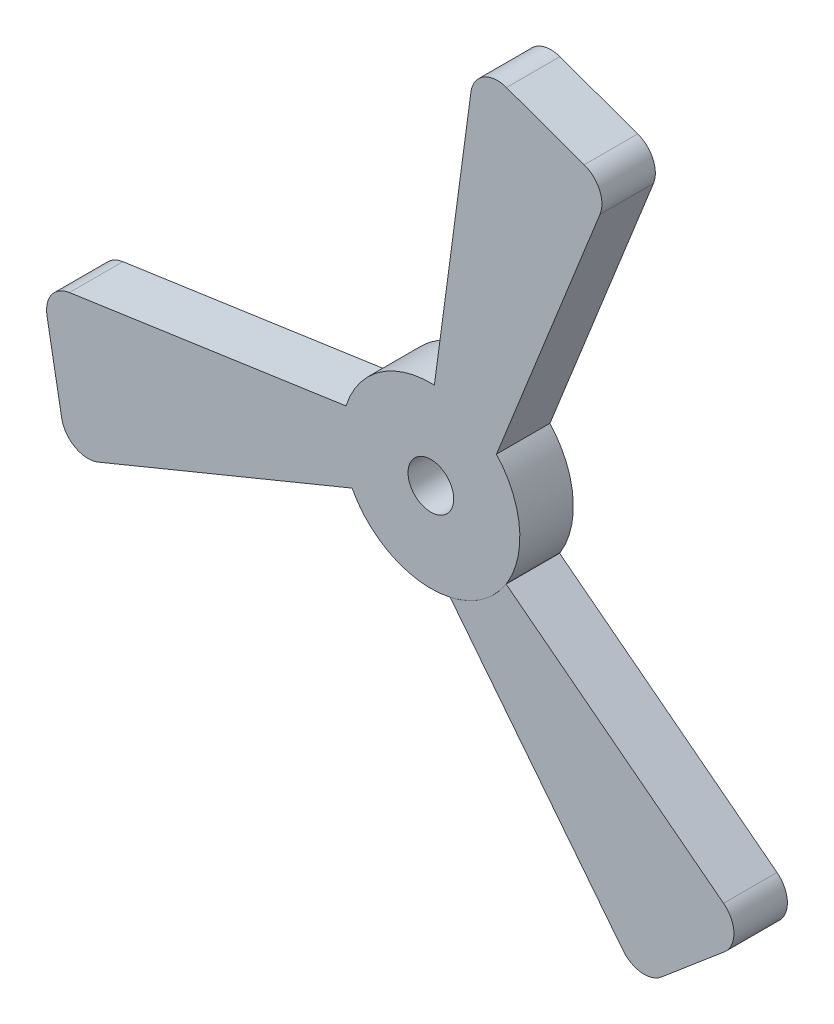
ISO-10303-21;
HEADER;
FILE_DESCRIPTION(('STEP AP214'),'2;1');
FILE_NAME('part.step','',(''),(''),'','','');
FILE_SCHEMA(('AUTOMOTIVE_DESIGN { 1 0 10303 214 1 1 1 1 }'));
ENDSEC;
DATA;
#1=APPLICATION_CONTEXT('core data for automotive mechanical design processes');
#2=APPLICATION_PROTOCOL_DEFINITION('international standard','automotive_design',2000,#1);
#3=PRODUCT_CONTEXT('',#1,'mechanical');
#4=PRODUCT('Part','Part','',(#3));
#5=PRODUCT_RELATED_PRODUCT_CATEGORY('part','',(#4));
#6=PRODUCT_DEFINITION_FORMATION('','',#4);
#7=PRODUCT_DEFINITION_CONTEXT('part definition',#1,'design');
#8=PRODUCT_DEFINITION('design','',#6,#7);
#9=PRODUCT_DEFINITION_SHAPE('','',#8);
#10=(LENGTH_UNIT() NAMED_UNIT(*) SI_UNIT(.MILLI.,.METRE.));
#11=(NAMED_UNIT(*) PLANE_ANGLE_UNIT() SI_UNIT($,.RADIAN.));
#12=(NAMED_UNIT(*) SI_UNIT($,.STERADIAN.) SOLID_ANGLE_UNIT());
#13=UNCERTAINTY_MEASURE_WITH_UNIT(LENGTH_MEASURE(1.E-05),#10,'distance_accuracy_value','');
#14=(GEOMETRIC_REPRESENTATION_CONTEXT(3) GLOBAL_UNCERTAINTY_ASSIGNED_CONTEXT((#13)) GLOBAL_UNIT_ASSIGNED_CONTEXT((#10,
#11,#12)) REPRESENTATION_CONTEXT('',''));
#15=CARTESIAN_POINT('',(0.,0.,0.));
#16=DIRECTION('',(0.,0.,1.));
#17=DIRECTION('',(1.,0.,0.));
#18=AXIS2_PLACEMENT_3D('',#15,#16,#17);
#19=CARTESIAN_POINT('',(14.2466992094165,-8.61707964663272,10.));
#20=CARTESIAN_POINT('',(10.5004524831012,-14.6092039712169,10.));
#21=CARTESIAN_POINT('',(3.6094824578494,-16.2540498456993,10.));
#22=B_SPLINE_CURVE_WITH_KNOTS('',2,(#19,#20,#21),.UNSPECIFIED.,.F.,.F.,(3,3),(0.,1.),.UNSPECIFIED.);
#23=DIRECTION('',(0.,0.,-1.));
#24=VECTOR('',#23,1.);
#25=SURFACE_OF_LINEAR_EXTRUSION('',#22,#24);
#26=CARTESIAN_POINT('',(14.2466992094165,-8.61707964663272,0.));
#27=CARTESIAN_POINT('',(10.5004524831012,-14.6092039712169,0.));
#28=CARTESIAN_POINT('',(3.6094824578494,-16.2540498456993,0.));
#29=B_SPLINE_CURVE_WITH_KNOTS('',2,(#26,#27,#28),.UNSPECIFIED.,.F.,.F.,(3,3),(0.,1.),.UNSPECIFIED.);
#30=CARTESIAN_POINT('',(14.2466992094165,-8.61707964663272,0.));
#31=VERTEX_POINT('',#30);
#32=CARTESIAN_POINT('',(3.6094824578494,-16.2540498456993,0.));
#33=VERTEX_POINT('',#32);
#34=EDGE_CURVE('E264',#31,#33,#29,.T.);
#35=ORIENTED_EDGE('',*,*,#34,.F.);
#36=DIRECTION('',(0.,0.,-1.));
#37=VECTOR('',#36,1.);
#38=CARTESIAN_POINT('',(14.2466992094165,-8.61707964663272,10.));
#39=LINE('',#38,#37);
#40=CARTESIAN_POINT('',(14.2466992094165,-8.61707964663272,10.));
#41=VERTEX_POINT('',#40);
#42=EDGE_CURVE('E13',#41,#31,#39,.T.);
#43=ORIENTED_EDGE('',*,*,#42,.F.);
#44=CARTESIAN_POINT('',(3.6094824578494,-16.2540498456993,10.));
#45=VERTEX_POINT('',#44);
#46=EDGE_CURVE('E315',#41,#45,#22,.T.);
#47=ORIENTED_EDGE('',*,*,#46,.T.);
#48=DIRECTION('',(0.,0.,-1.));
#49=VECTOR('',#48,1.);
#50=CARTESIAN_POINT('',(3.6094824578494,-16.2540498456993,10.));
#51=LINE('',#50,#49);
#52=EDGE_CURVE('E192',#45,#33,#51,.T.);
#53=ORIENTED_EDGE('',*,*,#52,.T.);
#54=EDGE_LOOP('',(#35,#43,#47,#53));
#55=FACE_BOUND('',#54,.T.);
#56=ADVANCED_FACE('F122',(#55),#25,.T.);
#57=CARTESIAN_POINT('',(0.,0.,10.));
#58=DIRECTION('',(0.,0.,-1.));
#59=DIRECTION('',(-1.,0.,0.));
#60=AXIS2_PLACEMENT_3D('',#57,#58,#59);
#61=CYLINDRICAL_SURFACE('',#60,16.65);
#62=CARTESIAN_POINT('',(0.,0.,0.));
#63=DIRECTION('',(0.,0.,1.));
#64=DIRECTION('',(1.,0.,0.));
#65=AXIS2_PLACEMENT_3D('',#62,#63,#64);
#66=CIRCLE('',#65,16.65);
#67=CARTESIAN_POINT('',(12.2716788518295,11.2529284258614,0.));
#68=VERTEX_POINT('',#67);
#69=EDGE_CURVE('E270',#31,#68,#66,.T.);
#70=ORIENTED_EDGE('',*,*,#69,.T.);
#71=DIRECTION('',(0.,0.,-1.));
#72=VECTOR('',#71,1.);
#73=CARTESIAN_POINT('',(12.2716788518295,11.2529284258614,10.));
#74=LINE('',#73,#72);
#75=CARTESIAN_POINT('',(12.2716788518295,11.2529284258614,10.));
#76=VERTEX_POINT('',#75);
#77=EDGE_CURVE('E132',#76,#68,#74,.T.);
#78=ORIENTED_EDGE('',*,*,#77,.F.);
#79=CARTESIAN_POINT('',(0.,0.,10.));
#80=DIRECTION('',(0.,0.,1.));
#81=DIRECTION('',(1.,0.,0.));
#82=AXIS2_PLACEMENT_3D('',#79,#80,#81);
#83=CIRCLE('',#82,16.65);
#84=EDGE_CURVE('E258',#41,#76,#83,.T.);
#85=ORIENTED_EDGE('',*,*,#84,.F.);
#86=ORIENTED_EDGE('',*,*,#42,.T.);
#87=EDGE_LOOP('',(#70,#78,#85,#86));
#88=FACE_BOUND('',#87,.T.);
#89=ADVANCED_FACE('F411',(#88),#61,.T.);
#90=CARTESIAN_POINT('',(6.71281847457781,-2.67851743529729,10.));
#91=DIRECTION('',(-0.928791721446579,0.370602129206378,0.));
#92=DIRECTION('',(-0.370602129206378,-0.928791721446579,0.));
#93=AXIS2_PLACEMENT_3D('',#90,#91,#92);
#94=PLANE('',#93);
#95=DIRECTION('',(0.370602129206378,0.928791721446579,0.));
#96=VECTOR('',#95,1.);
#97=CARTESIAN_POINT('',(6.71281847457781,-2.67851743529729,0.));
#98=LINE('',#97,#96);
#99=CARTESIAN_POINT('',(31.641495658147,59.7969708850077,0.));
#100=VERTEX_POINT('',#99);
#101=EDGE_CURVE('E276',#68,#100,#98,.T.);
#102=ORIENTED_EDGE('',*,*,#101,.T.);
#103=DIRECTION('',(0.,0.,-1.));
#104=VECTOR('',#103,1.);
#105=CARTESIAN_POINT('',(31.641495658147,59.7969708850077,10.));
#106=LINE('',#105,#104);
#107=CARTESIAN_POINT('',(31.641495658147,59.7969708850077,10.));
#108=VERTEX_POINT('',#107);
#109=EDGE_CURVE('E347',#108,#100,#106,.T.);
#110=ORIENTED_EDGE('',*,*,#109,.F.);
#111=DIRECTION('',(0.370602129206378,0.928791721446579,0.));
#112=VECTOR('',#111,1.);
#113=CARTESIAN_POINT('',(6.71281847457781,-2.67851743529729,10.));
#114=LINE('',#113,#112);
#115=EDGE_CURVE('E358',#76,#108,#114,.T.);
#116=ORIENTED_EDGE('',*,*,#115,.F.);
#117=ORIENTED_EDGE('',*,*,#77,.T.);
#118=EDGE_LOOP('',(#102,#110,#116,#117));
#119=FACE_BOUND('',#118,.T.);
#120=ADVANCED_FACE('F356',(#119),#94,.F.);
#121=CARTESIAN_POINT('',(26.9975370509138,61.6499815310397,10.));
#122=DIRECTION('',(0.,0.,-1.));
#123=DIRECTION('',(-1.,0.,0.));
#124=AXIS2_PLACEMENT_3D('',#121,#122,#123);
#125=CYLINDRICAL_SURFACE('',#124,4.99999999999987);
#126=CARTESIAN_POINT('',(26.9975370509138,61.6499815310397,0.));
#127=DIRECTION('',(0.,0.,1.));
#128=DIRECTION('',(1.,0.,0.));
#129=AXIS2_PLACEMENT_3D('',#126,#127,#128);
#130=CIRCLE('',#129,4.99999999999987);
#131=CARTESIAN_POINT('',(28.6898523428667,66.3548799308585,0.));
#132=VERTEX_POINT('',#131);
#133=EDGE_CURVE('E281',#100,#132,#130,.T.);
#134=ORIENTED_EDGE('',*,*,#133,.T.);
#135=DIRECTION('',(0.,0.,-1.));
#136=VECTOR('',#135,1.);
#137=CARTESIAN_POINT('',(28.6898523428667,66.3548799308585,10.));
#138=LINE('',#137,#136);
#139=CARTESIAN_POINT('',(28.6898523428667,66.3548799308585,10.));
#140=VERTEX_POINT('',#139);
#141=EDGE_CURVE('E343',#140,#132,#138,.T.);
#142=ORIENTED_EDGE('',*,*,#141,.F.);
#143=CARTESIAN_POINT('',(26.9975370509138,61.6499815310397,10.));
#144=DIRECTION('',(0.,0.,1.));
#145=DIRECTION('',(1.,0.,0.));
#146=AXIS2_PLACEMENT_3D('',#143,#144,#145);
#147=CIRCLE('',#146,4.99999999999987);
#148=EDGE_CURVE('E379',#108,#140,#147,.T.);
#149=ORIENTED_EDGE('',*,*,#148,.F.);
#150=ORIENTED_EDGE('',*,*,#109,.T.);
#151=EDGE_LOOP('',(#134,#142,#149,#150));
#152=FACE_BOUND('',#151,.T.);
#153=ADVANCED_FACE('F368',(#152),#125,.T.);
#154=CARTESIAN_POINT('',(24.4197877337741,67.8907888966862,10.));
#155=DIRECTION('',(-0.338463058390458,-0.940979679963908,0.));
#156=DIRECTION('',(0.940979679963908,-0.338463058390458,0.));
#157=AXIS2_PLACEMENT_3D('',#154,#155,#156);
#158=PLANE('',#157);
#159=DIRECTION('',(-0.940979679963908,0.338463058390458,0.));
#160=VECTOR('',#159,1.);
#161=CARTESIAN_POINT('',(24.4197877337741,67.8907888966862,0.));
#162=LINE('',#161,#160);
#163=CARTESIAN_POINT('',(14.140821367215,71.5880530008927,0.));
#164=VERTEX_POINT('',#163);
#165=EDGE_CURVE('E284',#132,#164,#162,.T.);
#166=ORIENTED_EDGE('',*,*,#165,.T.);
#167=DIRECTION('',(0.,0.,-1.));
#168=VECTOR('',#167,1.);
#169=CARTESIAN_POINT('',(14.140821367215,71.5880530008927,10.));
#170=LINE('',#169,#168);
#171=CARTESIAN_POINT('',(14.140821367215,71.5880530008927,10.));
#172=VERTEX_POINT('',#171);
#173=EDGE_CURVE('E340',#172,#164,#170,.T.);
#174=ORIENTED_EDGE('',*,*,#173,.F.);
#175=DIRECTION('',(-0.940979679963908,0.338463058390458,0.));
#176=VECTOR('',#175,1.);
#177=CARTESIAN_POINT('',(24.4197877337741,67.8907888966862,10.));
#178=LINE('',#177,#176);
#179=EDGE_CURVE('E374',#140,#172,#178,.T.);
#180=ORIENTED_EDGE('',*,*,#179,.F.);
#181=ORIENTED_EDGE('',*,*,#141,.T.);
#182=EDGE_LOOP('',(#166,#174,#180,#181));
#183=FACE_BOUND('',#182,.T.);
#184=ADVANCED_FACE('F372',(#183),#158,.F.);
#185=CARTESIAN_POINT('',(12.4485060752628,66.8831546010737,10.));
#186=DIRECTION('',(0.,0.,-1.));
#187=DIRECTION('',(-1.,0.,0.));
#188=AXIS2_PLACEMENT_3D('',#185,#186,#187);
#189=CYLINDRICAL_SURFACE('',#188,4.9999999999995);
#190=CARTESIAN_POINT('',(12.4485060752628,66.8831546010737,0.));
#191=DIRECTION('',(0.,0.,1.));
#192=DIRECTION('',(1.,0.,0.));
#193=AXIS2_PLACEMENT_3D('',#190,#191,#192);
#194=CIRCLE('',#193,4.9999999999995);
#195=CARTESIAN_POINT('',(7.49295098043253,67.548341568848,0.));
#196=VERTEX_POINT('',#195);
#197=EDGE_CURVE('E288',#196,#164,#194,.F.);
#198=ORIENTED_EDGE('',*,*,#197,.F.);
#199=DIRECTION('',(0.,0.,-1.));
#200=VECTOR('',#199,1.);
#201=CARTESIAN_POINT('',(7.49295098043253,67.548341568848,10.));
#202=LINE('',#201,#200);
#203=CARTESIAN_POINT('',(7.49295098043253,67.548341568848,10.));
#204=VERTEX_POINT('',#203);
#205=EDGE_CURVE('E337',#204,#196,#202,.T.);
#206=ORIENTED_EDGE('',*,*,#205,.F.);
#207=CARTESIAN_POINT('',(12.4485060752628,66.8831546010737,10.));
#208=DIRECTION('',(0.,0.,1.));
#209=DIRECTION('',(1.,0.,0.));
#210=AXIS2_PLACEMENT_3D('',#207,#208,#209);
#211=CIRCLE('',#210,4.9999999999995);
#212=EDGE_CURVE('E378',#204,#172,#211,.F.);
#213=ORIENTED_EDGE('',*,*,#212,.T.);
#214=ORIENTED_EDGE('',*,*,#173,.T.);
#215=EDGE_LOOP('',(#198,#206,#213,#214));
#216=FACE_BOUND('',#215,.T.);
#217=ADVANCED_FACE('F463',(#216),#189,.T.);
#218=CARTESIAN_POINT('',(-1.54624124050459,0.207552837681459,10.));
#219=DIRECTION('',(-0.991111018966153,0.133037393554875,0.));
#220=DIRECTION('',(-0.133037393554875,-0.991111018966153,0.));
#221=AXIS2_PLACEMENT_3D('',#218,#219,#220);
#222=PLANE('',#221);
#223=DIRECTION('',(0.133037393554875,0.991111018966153,0.));
#224=VECTOR('',#223,1.);
#225=CARTESIAN_POINT('',(-1.54624124050459,0.207552837681459,0.));
#226=LINE('',#225,#224);
#227=CARTESIAN_POINT('',(0.659086049208291,16.636950008332,0.));
#228=VERTEX_POINT('',#227);
#229=EDGE_CURVE('E292',#228,#196,#226,.T.);
#230=ORIENTED_EDGE('',*,*,#229,.F.);
#231=DIRECTION('',(0.,0.,-1.));
#232=VECTOR('',#231,1.);
#233=CARTESIAN_POINT('',(0.659086049208291,16.636950008332,10.));
#234=LINE('',#233,#232);
#235=CARTESIAN_POINT('',(0.659086049208291,16.636950008332,10.));
#236=VERTEX_POINT('',#235);
#237=EDGE_CURVE('E334',#236,#228,#234,.T.);
#238=ORIENTED_EDGE('',*,*,#237,.F.);
#239=DIRECTION('',(0.133037393554875,0.991111018966153,0.));
#240=VECTOR('',#239,1.);
#241=CARTESIAN_POINT('',(-1.54624124050459,0.207552837681459,10.));
#242=LINE('',#241,#240);
#243=EDGE_CURVE('E383',#236,#204,#242,.T.);
#244=ORIENTED_EDGE('',*,*,#243,.T.);
#245=ORIENTED_EDGE('',*,*,#205,.T.);
#246=EDGE_LOOP('',(#230,#238,#244,#245));
#247=FACE_BOUND('',#246,.T.);
#248=ADVANCED_FACE('F425',(#247),#222,.T.);
#249=CARTESIAN_POINT('',(-15.8811613096788,5.00112141983785,0.));
#250=VERTEX_POINT('',#249);
#251=EDGE_CURVE('E278',#228,#250,#66,.T.);
#252=ORIENTED_EDGE('',*,*,#251,.T.);
#253=DIRECTION('',(0.,0.,-1.));
#254=VECTOR('',#253,1.);
#255=CARTESIAN_POINT('',(-15.8811613096788,5.00112141983785,10.));
#256=LINE('',#255,#254);
#257=CARTESIAN_POINT('',(-15.8811613096788,5.00112141983785,10.));
#258=VERTEX_POINT('',#257);
#259=EDGE_CURVE('E330',#258,#250,#256,.T.);
#260=ORIENTED_EDGE('',*,*,#259,.F.);
#261=EDGE_CURVE('E257',#236,#258,#83,.T.);
#262=ORIENTED_EDGE('',*,*,#261,.F.);
#263=ORIENTED_EDGE('',*,*,#237,.T.);
#264=EDGE_LOOP('',(#252,#260,#262,#263));
#265=FACE_BOUND('',#264,.T.);
#266=ADVANCED_FACE('F416',(#265),#61,.T.);
#267=CARTESIAN_POINT('',(-1.03674509384194,7.15273004762653,10.));
#268=DIRECTION('',(0.143445002133967,-0.989658290200606,0.));
#269=DIRECTION('',(0.989658290200606,0.143445002133967,0.));
#270=AXIS2_PLACEMENT_3D('',#267,#268,#269);
#271=PLANE('',#270);
#272=DIRECTION('',(-0.989658290200606,-0.143445002133967,0.));
#273=VECTOR('',#272,1.);
#274=CARTESIAN_POINT('',(-1.03674509384194,7.15273004762653,0.));
#275=LINE('',#274,#273);
#276=CARTESIAN_POINT('',(-67.6064436848487,-2.49614638881387,0.));
#277=VERTEX_POINT('',#276);
#278=EDGE_CURVE('E296',#250,#277,#275,.T.);
#279=ORIENTED_EDGE('',*,*,#278,.T.);
#280=DIRECTION('',(0.,0.,-1.));
#281=VECTOR('',#280,1.);
#282=CARTESIAN_POINT('',(-67.6064436848487,-2.49614638881387,10.));
#283=LINE('',#282,#281);
#284=CARTESIAN_POINT('',(-67.6064436848487,-2.49614638881387,10.));
#285=VERTEX_POINT('',#284);
#286=EDGE_CURVE('E326',#285,#277,#283,.T.);
#287=ORIENTED_EDGE('',*,*,#286,.F.);
#288=DIRECTION('',(-0.989658290200606,-0.143445002133967,0.));
#289=VECTOR('',#288,1.);
#290=CARTESIAN_POINT('',(-1.03674509384194,7.15273004762653,10.));
#291=LINE('',#290,#289);
#292=EDGE_CURVE('E391',#258,#285,#291,.T.);
#293=ORIENTED_EDGE('',*,*,#292,.F.);
#294=ORIENTED_EDGE('',*,*,#259,.T.);
#295=EDGE_LOOP('',(#279,#287,#293,#294));
#296=FACE_BOUND('',#295,.T.);
#297=ADVANCED_FACE('F424',(#296),#271,.F.);
#298=CARTESIAN_POINT('',(-66.8892186741787,-7.44443783981714,10.));
#299=DIRECTION('',(0.,0.,-1.));
#300=DIRECTION('',(-1.,0.,0.));
#301=AXIS2_PLACEMENT_3D('',#298,#299,#300);
#302=CYLINDRICAL_SURFACE('',#301,4.99999999999987);
#303=CARTESIAN_POINT('',(-66.8892186741787,-7.44443783981714,0.));
#304=DIRECTION('',(0.,0.,1.));
#305=DIRECTION('',(1.,0.,0.));
#306=AXIS2_PLACEMENT_3D('',#303,#304,#305);
#307=CIRCLE('',#306,4.99999999999987);
#308=CARTESIAN_POINT('',(-71.8099378566229,-8.33129900568256,0.));
#309=VERTEX_POINT('',#308);
#310=EDGE_CURVE('E299',#277,#309,#307,.T.);
#311=ORIENTED_EDGE('',*,*,#310,.T.);
#312=DIRECTION('',(0.,0.,-1.));
#313=VECTOR('',#312,1.);
#314=CARTESIAN_POINT('',(-71.8099378566229,-8.33129900568256,10.));
#315=LINE('',#314,#313);
#316=CARTESIAN_POINT('',(-71.8099378566229,-8.33129900568256,10.));
#317=VERTEX_POINT('',#316);
#318=EDGE_CURVE('E322',#317,#309,#315,.T.);
#319=ORIENTED_EDGE('',*,*,#318,.F.);
#320=CARTESIAN_POINT('',(-66.8892186741787,-7.44443783981714,10.));
#321=DIRECTION('',(0.,0.,1.));
#322=DIRECTION('',(1.,0.,0.));
#323=AXIS2_PLACEMENT_3D('',#320,#321,#322);
#324=CIRCLE('',#323,4.99999999999987);
#325=EDGE_CURVE('E394',#285,#317,#324,.T.);
#326=ORIENTED_EDGE('',*,*,#325,.F.);
#327=ORIENTED_EDGE('',*,*,#286,.T.);
#328=EDGE_LOOP('',(#311,#319,#326,#327));
#329=FACE_BOUND('',#328,.T.);
#330=ADVANCED_FACE('F446',(#329),#302,.T.);
#331=CARTESIAN_POINT('',(-71.0050417343838,-12.7972379158714,10.));
#332=DIRECTION('',(0.984143836488923,0.177372233173246,0.));
#333=DIRECTION('',(-0.177372233173246,0.984143836488923,0.));
#334=AXIS2_PLACEMENT_3D('',#331,#332,#333);
#335=PLANE('',#334);
#336=DIRECTION('',(0.177372233173246,-0.984143836488923,0.));
#337=VECTOR('',#336,1.);
#338=CARTESIAN_POINT('',(-71.0050417343838,-12.7972379158714,0.));
#339=LINE('',#338,#337);
#340=CARTESIAN_POINT('',(-69.0674831898473,-23.5477159660607,0.));
#341=VERTEX_POINT('',#340);
#342=EDGE_CURVE('E302',#309,#341,#339,.T.);
#343=ORIENTED_EDGE('',*,*,#342,.T.);
#344=DIRECTION('',(0.,0.,-1.));
#345=VECTOR('',#344,1.);
#346=CARTESIAN_POINT('',(-69.0674831898473,-23.5477159660607,10.));
#347=LINE('',#346,#345);
#348=CARTESIAN_POINT('',(-69.0674831898473,-23.5477159660607,10.));
#349=VERTEX_POINT('',#348);
#350=EDGE_CURVE('E241',#349,#341,#347,.T.);
#351=ORIENTED_EDGE('',*,*,#350,.F.);
#352=DIRECTION('',(0.177372233173246,-0.984143836488923,0.));
#353=VECTOR('',#352,1.);
#354=CARTESIAN_POINT('',(-71.0050417343838,-12.7972379158714,10.));
#355=LINE('',#354,#353);
#356=EDGE_CURVE('E247',#317,#349,#355,.T.);
#357=ORIENTED_EDGE('',*,*,#356,.F.);
#358=ORIENTED_EDGE('',*,*,#318,.T.);
#359=EDGE_LOOP('',(#343,#351,#357,#358));
#360=FACE_BOUND('',#359,.T.);
#361=ADVANCED_FACE('F449',(#360),#335,.F.);
#362=CARTESIAN_POINT('',(-64.1467640074032,-22.6608548001946,10.));
#363=DIRECTION('',(0.,0.,-1.));
#364=DIRECTION('',(-1.,0.,0.));
#365=AXIS2_PLACEMENT_3D('',#362,#363,#364);
#366=CYLINDRICAL_SURFACE('',#365,4.99999999999951);
#367=CARTESIAN_POINT('',(-64.1467640074032,-22.6608548001946,0.));
#368=DIRECTION('',(0.,0.,1.));
#369=DIRECTION('',(1.,0.,0.));
#370=AXIS2_PLACEMENT_3D('',#367,#368,#369);
#371=CIRCLE('',#370,4.99999999999951);
#372=CARTESIAN_POINT('',(-62.2450552723469,-27.2850848860582,0.));
#373=VERTEX_POINT('',#372);
#374=EDGE_CURVE('E235',#373,#341,#371,.F.);
#375=ORIENTED_EDGE('',*,*,#374,.F.);
#376=DIRECTION('',(0.,0.,-1.));
#377=VECTOR('',#376,1.);
#378=CARTESIAN_POINT('',(-62.2450552723469,-27.2850848860582,10.));
#379=LINE('',#378,#377);
#380=CARTESIAN_POINT('',(-62.2450552723469,-27.2850848860582,10.));
#381=VERTEX_POINT('',#380);
#382=EDGE_CURVE('E230',#381,#373,#379,.T.);
#383=ORIENTED_EDGE('',*,*,#382,.F.);
#384=CARTESIAN_POINT('',(-64.1467640074032,-22.6608548001946,10.));
#385=DIRECTION('',(0.,0.,1.));
#386=DIRECTION('',(1.,0.,0.));
#387=AXIS2_PLACEMENT_3D('',#384,#385,#386);
#388=CIRCLE('',#387,4.99999999999951);
#389=EDGE_CURVE('E233',#381,#349,#388,.F.);
#390=ORIENTED_EDGE('',*,*,#389,.T.);
#391=ORIENTED_EDGE('',*,*,#350,.T.);
#392=EDGE_LOOP('',(#375,#383,#390,#391));
#393=FACE_BOUND('',#392,.T.);
#394=ADVANCED_FACE('F232',(#393),#366,.T.);
#395=CARTESIAN_POINT('',(0.593374590192608,-1.44286061349686,10.));
#396=DIRECTION('',(0.380341747011291,-0.924846017172805,0.));
#397=DIRECTION('',(0.924846017172805,0.380341747011291,0.));
#398=AXIS2_PLACEMENT_3D('',#395,#396,#397);
#399=PLANE('',#398);
#400=DIRECTION('',(-0.924846017172805,-0.380341747011291,0.));
#401=VECTOR('',#400,1.);
#402=CARTESIAN_POINT('',(0.593374590192608,-1.44286061349686,0.));
#403=LINE('',#402,#401);
#404=CARTESIAN_POINT('',(-14.7375643733114,-7.74768974227178,0.));
#405=VERTEX_POINT('',#404);
#406=EDGE_CURVE('E308',#405,#373,#403,.T.);
#407=ORIENTED_EDGE('',*,*,#406,.F.);
#408=DIRECTION('',(0.,0.,-1.));
#409=VECTOR('',#408,1.);
#410=CARTESIAN_POINT('',(-14.7375643733114,-7.74768974227178,10.));
#411=LINE('',#410,#409);
#412=CARTESIAN_POINT('',(-14.7375643733114,-7.74768974227178,10.));
#413=VERTEX_POINT('',#412);
#414=EDGE_CURVE('E185',#413,#405,#411,.T.);
#415=ORIENTED_EDGE('',*,*,#414,.F.);
#416=DIRECTION('',(-0.924846017172805,-0.380341747011291,0.));
#417=VECTOR('',#416,1.);
#418=CARTESIAN_POINT('',(0.593374590192608,-1.44286061349686,10.));
#419=LINE('',#418,#417);
#420=EDGE_CURVE('E245',#413,#381,#419,.T.);
#421=ORIENTED_EDGE('',*,*,#420,.T.);
#422=ORIENTED_EDGE('',*,*,#382,.T.);
#423=EDGE_LOOP('',(#407,#415,#421,#422));
#424=FACE_BOUND('',#423,.T.);
#425=ADVANCED_FACE('F251',(#424),#399,.T.);
#426=EDGE_CURVE('E277',#405,#33,#66,.T.);
#427=ORIENTED_EDGE('',*,*,#426,.T.);
#428=ORIENTED_EDGE('',*,*,#52,.F.);
#429=EDGE_CURVE('E140',#413,#45,#83,.T.);
#430=ORIENTED_EDGE('',*,*,#429,.F.);
#431=ORIENTED_EDGE('',*,*,#414,.T.);
#432=EDGE_LOOP('',(#427,#428,#430,#431));
#433=FACE_BOUND('',#432,.T.);
#434=ADVANCED_FACE('F417',(#433),#61,.T.);
#435=CARTESIAN_POINT('',(0.,0.,10.));
#436=DIRECTION('',(0.,0.,-1.));
#437=DIRECTION('',(-1.,0.,0.));
#438=AXIS2_PLACEMENT_3D('',#435,#436,#437);
#439=CYLINDRICAL_SURFACE('',#438,4.27287468488291);
#440=CARTESIAN_POINT('',(0.,0.,10.));
#441=DIRECTION('',(0.,0.,1.));
#442=DIRECTION('',(1.,0.,0.));
#443=AXIS2_PLACEMENT_3D('',#440,#441,#442);
#444=CIRCLE('',#443,4.27287468488291);
#445=CARTESIAN_POINT('',(4.27287468488291,0.,10.));
#446=VERTEX_POINT('',#445);
#447=EDGE_CURVE('E255',#446,#446,#444,.T.);
#448=ORIENTED_EDGE('',*,*,#447,.T.);
#449=EDGE_LOOP('',(#448));
#450=FACE_BOUND('',#449,.T.);
#451=CARTESIAN_POINT('',(0.,0.,0.));
#452=DIRECTION('',(0.,0.,1.));
#453=DIRECTION('',(1.,0.,0.));
#454=AXIS2_PLACEMENT_3D('',#451,#452,#453);
#455=CIRCLE('',#454,4.27287468488291);
#456=CARTESIAN_POINT('',(4.27287468488291,0.,0.));
#457=VERTEX_POINT('',#456);
#458=EDGE_CURVE('E311',#457,#457,#455,.T.);
#459=ORIENTED_EDGE('',*,*,#458,.F.);
#460=EDGE_LOOP('',(#459));
#461=FACE_BOUND('',#460,.T.);
#462=ADVANCED_FACE('F428',(#450,#461),#439,.F.);
#463=CARTESIAN_POINT('',(0.,0.,10.));
#464=DIRECTION('',(0.,0.,1.));
#465=DIRECTION('',(1.,0.,0.));
#466=AXIS2_PLACEMENT_3D('',#463,#464,#465);
#467=PLANE('',#466);
#468=ORIENTED_EDGE('',*,*,#46,.F.);
#469=ORIENTED_EDGE('',*,*,#84,.T.);
#470=ORIENTED_EDGE('',*,*,#115,.T.);
#471=ORIENTED_EDGE('',*,*,#148,.T.);
#472=ORIENTED_EDGE('',*,*,#179,.T.);
#473=ORIENTED_EDGE('',*,*,#212,.F.);
#474=ORIENTED_EDGE('',*,*,#243,.F.);
#475=ORIENTED_EDGE('',*,*,#261,.T.);
#476=ORIENTED_EDGE('',*,*,#292,.T.);
#477=ORIENTED_EDGE('',*,*,#325,.T.);
#478=ORIENTED_EDGE('',*,*,#356,.T.);
#479=ORIENTED_EDGE('',*,*,#389,.F.);
#480=ORIENTED_EDGE('',*,*,#420,.F.);
#481=ORIENTED_EDGE('',*,*,#429,.T.);
#482=EDGE_LOOP('',(#468,#469,#470,#471,#472,#473,#474,#475,#476,#477,#478,#479,#480,#481));
#483=FACE_BOUND('',#482,.T.);
#484=ORIENTED_EDGE('',*,*,#447,.F.);
#485=EDGE_LOOP('',(#484));
#486=FACE_BOUND('',#485,.T.);
#487=ADVANCED_FACE('F243',(#483,#486),#467,.T.);
#488=CARTESIAN_POINT('',(0.,0.,0.));
#489=DIRECTION('',(0.,0.,1.));
#490=DIRECTION('',(1.,0.,0.));
#491=AXIS2_PLACEMENT_3D('',#488,#489,#490);
#492=PLANE('',#491);
#493=ORIENTED_EDGE('',*,*,#34,.T.);
#494=ORIENTED_EDGE('',*,*,#426,.F.);
#495=ORIENTED_EDGE('',*,*,#406,.T.);
#496=ORIENTED_EDGE('',*,*,#374,.T.);
#497=ORIENTED_EDGE('',*,*,#342,.F.);
#498=ORIENTED_EDGE('',*,*,#310,.F.);
#499=ORIENTED_EDGE('',*,*,#278,.F.);
#500=ORIENTED_EDGE('',*,*,#251,.F.);
#501=ORIENTED_EDGE('',*,*,#229,.T.);
#502=ORIENTED_EDGE('',*,*,#197,.T.);
#503=ORIENTED_EDGE('',*,*,#165,.F.);
#504=ORIENTED_EDGE('',*,*,#133,.F.);
#505=ORIENTED_EDGE('',*,*,#101,.F.);
#506=ORIENTED_EDGE('',*,*,#69,.F.);
#507=EDGE_LOOP('',(#493,#494,#495,#496,#497,#498,#499,#500,#501,#502,#503,#504,#505,#506));
#508=FACE_BOUND('',#507,.T.);
#509=ORIENTED_EDGE('',*,*,#458,.T.);
#510=EDGE_LOOP('',(#509));
#511=FACE_BOUND('',#510,.T.);
#512=ADVANCED_FACE('F363',(#508,#511),#492,.F.);
#513=CLOSED_SHELL('',(#56,#89,#120,#153,#184,#217,#248,#266,#297,#330,#361,#394,#425,#434,#462,
#487,#512));
#514=MANIFOLD_SOLID_BREP('B2',#513);
#515=CARTESIAN_POINT('',(-5.67607338073586,-4.47421261232929,10.));
#516=DIRECTION('',(0.78534671931261,0.619056160994235,0.));
#517=DIRECTION('',(-0.619056160994235,0.78534671931261,0.));
#518=AXIS2_PLACEMENT_3D('',#515,#516,#517);
#519=PLANE('',#518);
#520=DIRECTION('',(0.619056160994235,-0.78534671931261,0.));
#521=VECTOR('',#520,1.);
#522=CARTESIAN_POINT('',(-5.67607338073586,-4.47421261232929,0.));
#523=LINE('',#522,#521);
#524=CARTESIAN_POINT('',(3.6094824578494,-16.2540498456993,0.));
#525=VERTEX_POINT('',#524);
#526=CARTESIAN_POINT('',(35.9649480267022,-57.3008244961939,0.));
#527=VERTEX_POINT('',#526);
#528=EDGE_CURVE('E666',#525,#527,#523,.T.);
#529=ORIENTED_EDGE('',*,*,#528,.T.);
#530=DIRECTION('',(0.,0.,-1.));
#531=VECTOR('',#530,1.);
#532=CARTESIAN_POINT('',(35.9649480267022,-57.3008244961939,10.));
#533=LINE('',#532,#531);
#534=CARTESIAN_POINT('',(35.9649480267022,-57.3008244961939,10.));
#535=VERTEX_POINT('',#534);
#536=EDGE_CURVE('E120',#535,#527,#533,.T.);
#537=ORIENTED_EDGE('',*,*,#536,.F.);
#538=DIRECTION('',(0.619056160994235,-0.78534671931261,0.));
#539=VECTOR('',#538,1.);
#540=CARTESIAN_POINT('',(-5.67607338073586,-4.47421261232929,10.));
#541=LINE('',#540,#539);
#542=CARTESIAN_POINT('',(3.6094824578494,-16.2540498456993,10.));
#543=VERTEX_POINT('',#542);
#544=EDGE_CURVE('E679',#543,#535,#541,.T.);
#545=ORIENTED_EDGE('',*,*,#544,.F.);
#546=DIRECTION('',(0.,0.,-1.));
#547=VECTOR('',#546,1.);
#548=CARTESIAN_POINT('',(3.6094824578494,-16.2540498456993,10.));
#549=LINE('',#548,#547);
#550=EDGE_CURVE('E598',#543,#525,#549,.T.);
#551=ORIENTED_EDGE('',*,*,#550,.T.);
#552=EDGE_LOOP('',(#529,#537,#545,#551));
#553=FACE_BOUND('',#552,.T.);
#554=ADVANCED_FACE('F582',(#553),#519,.F.);
#555=CARTESIAN_POINT('',(39.8916816232654,-54.2055436912225,10.));
#556=DIRECTION('',(0.,0.,-1.));
#557=DIRECTION('',(-1.,0.,0.));
#558=AXIS2_PLACEMENT_3D('',#555,#556,#557);
#559=CYLINDRICAL_SURFACE('',#558,4.99999999999987);
#560=CARTESIAN_POINT('',(39.8916816232654,-54.2055436912225,0.));
#561=DIRECTION('',(0.,0.,1.));
#562=DIRECTION('',(1.,0.,0.));
#563=AXIS2_PLACEMENT_3D('',#560,#561,#562);
#564=CIRCLE('',#563,4.99999999999987);
#565=CARTESIAN_POINT('',(43.1200855137569,-58.0235809251758,0.));
#566=VERTEX_POINT('',#565);
#567=EDGE_CURVE('E668',#527,#566,#564,.T.);
#568=ORIENTED_EDGE('',*,*,#567,.T.);
#569=DIRECTION('',(0.,0.,-1.));
#570=VECTOR('',#569,1.);
#571=CARTESIAN_POINT('',(43.1200855137569,-58.0235809251758,10.));
#572=LINE('',#571,#570);
#573=CARTESIAN_POINT('',(43.1200855137569,-58.0235809251758,10.));
#574=VERTEX_POINT('',#573);
#575=EDGE_CURVE('E590',#574,#566,#572,.T.);
#576=ORIENTED_EDGE('',*,*,#575,.F.);
#577=CARTESIAN_POINT('',(39.8916816232654,-54.2055436912225,10.));
#578=DIRECTION('',(0.,0.,1.));
#579=DIRECTION('',(1.,0.,0.));
#580=AXIS2_PLACEMENT_3D('',#577,#578,#579);
#581=CIRCLE('',#580,4.99999999999987);
#582=EDGE_CURVE('E630',#535,#574,#581,.T.);
#583=ORIENTED_EDGE('',*,*,#582,.F.);
#584=ORIENTED_EDGE('',*,*,#536,.T.);
#585=EDGE_LOOP('',(#568,#576,#583,#584));
#586=FACE_BOUND('',#585,.T.);
#587=ADVANCED_FACE('F699',(#586),#559,.T.);
#588=CARTESIAN_POINT('',(46.5852540006102,-55.0935509808147,10.));
#589=DIRECTION('',(-0.645680778098473,0.76360744679066,0.));
#590=DIRECTION('',(-0.76360744679066,-0.645680778098473,0.));
#591=AXIS2_PLACEMENT_3D('',#588,#589,#590);
#592=PLANE('',#591);
#593=DIRECTION('',(0.76360744679066,0.645680778098473,0.));
#594=VECTOR('',#593,1.);
#595=CARTESIAN_POINT('',(46.5852540006102,-55.0935509808147,0.));
#596=LINE('',#595,#594);
#597=CARTESIAN_POINT('',(54.9266618226329,-48.0403370348318,0.));
#598=VERTEX_POINT('',#597);
#599=EDGE_CURVE('E670',#566,#598,#596,.T.);
#600=ORIENTED_EDGE('',*,*,#599,.T.);
#601=DIRECTION('',(0.,0.,-1.));
#602=VECTOR('',#601,1.);
#603=CARTESIAN_POINT('',(54.9266618226329,-48.0403370348318,10.));
#604=LINE('',#603,#602);
#605=CARTESIAN_POINT('',(54.9266618226329,-48.0403370348318,10.));
#606=VERTEX_POINT('',#605);
#607=EDGE_CURVE('E649',#606,#598,#604,.T.);
#608=ORIENTED_EDGE('',*,*,#607,.F.);
#609=DIRECTION('',(0.76360744679066,0.645680778098473,0.));
#610=VECTOR('',#609,1.);
#611=CARTESIAN_POINT('',(46.5852540006102,-55.0935509808147,10.));
#612=LINE('',#611,#610);
#613=EDGE_CURVE('E657',#574,#606,#612,.T.);
#614=ORIENTED_EDGE('',*,*,#613,.F.);
#615=ORIENTED_EDGE('',*,*,#575,.T.);
#616=EDGE_LOOP('',(#600,#608,#614,#615));
#617=FACE_BOUND('',#616,.T.);
#618=ADVANCED_FACE('F685',(#617),#592,.F.);
#619=CARTESIAN_POINT('',(51.6982579321409,-44.2222998008789,10.));
#620=DIRECTION('',(0.,0.,-1.));
#621=DIRECTION('',(-1.,0.,0.));
#622=AXIS2_PLACEMENT_3D('',#619,#620,#621);
#623=CYLINDRICAL_SURFACE('',#622,4.99999999999951);
#624=CARTESIAN_POINT('',(51.6982579321409,-44.2222998008789,0.));
#625=DIRECTION('',(0.,0.,1.));
#626=DIRECTION('',(1.,0.,0.));
#627=AXIS2_PLACEMENT_3D('',#624,#625,#626);
#628=CIRCLE('',#627,4.99999999999951);
#629=CARTESIAN_POINT('',(54.7521042919148,-40.2632566827896,0.));
#630=VERTEX_POINT('',#629);
#631=EDGE_CURVE('E645',#630,#598,#628,.F.);
#632=ORIENTED_EDGE('',*,*,#631,.F.);
#633=DIRECTION('',(0.,0.,-1.));
#634=VECTOR('',#633,1.);
#635=CARTESIAN_POINT('',(54.7521042919148,-40.2632566827896,10.));
#636=LINE('',#635,#634);
#637=CARTESIAN_POINT('',(54.7521042919148,-40.2632566827896,10.));
#638=VERTEX_POINT('',#637);
#639=EDGE_CURVE('E640',#638,#630,#636,.T.);
#640=ORIENTED_EDGE('',*,*,#639,.F.);
#641=CARTESIAN_POINT('',(51.6982579321409,-44.2222998008789,10.));
#642=DIRECTION('',(0.,0.,1.));
#643=DIRECTION('',(1.,0.,0.));
#644=AXIS2_PLACEMENT_3D('',#641,#642,#643);
#645=CIRCLE('',#644,4.99999999999951);
#646=EDGE_CURVE('E643',#638,#606,#645,.F.);
#647=ORIENTED_EDGE('',*,*,#646,.T.);
#648=ORIENTED_EDGE('',*,*,#607,.T.);
#649=EDGE_LOOP('',(#632,#640,#647,#648));
#650=FACE_BOUND('',#649,.T.);
#651=ADVANCED_FACE('F642',(#650),#623,.T.);
#652=CARTESIAN_POINT('',(0.952866650311972,1.23530777581541,10.));
#653=DIRECTION('',(0.610769271954859,0.791808623617937,0.));
#654=DIRECTION('',(-0.791808623617937,0.610769271954859,0.));
#655=AXIS2_PLACEMENT_3D('',#652,#653,#654);
#656=PLANE('',#655);
#657=DIRECTION('',(0.791808623617937,-0.610769271954859,0.));
#658=VECTOR('',#657,1.);
#659=CARTESIAN_POINT('',(0.952866650311972,1.23530777581541,0.));
#660=LINE('',#659,#658);
#661=CARTESIAN_POINT('',(14.0784783241032,-8.88926026606018,0.));
#662=VERTEX_POINT('',#661);
#663=EDGE_CURVE('E674',#662,#630,#660,.T.);
#664=ORIENTED_EDGE('',*,*,#663,.F.);
#665=DIRECTION('',(0.,0.,-1.));
#666=VECTOR('',#665,1.);
#667=CARTESIAN_POINT('',(14.0784783241032,-8.88926026606018,10.));
#668=LINE('',#667,#666);
#669=CARTESIAN_POINT('',(14.0784783241032,-8.88926026606018,10.));
#670=VERTEX_POINT('',#669);
#671=EDGE_CURVE('E618',#670,#662,#668,.T.);
#672=ORIENTED_EDGE('',*,*,#671,.F.);
#673=DIRECTION('',(0.791808623617937,-0.610769271954859,0.));
#674=VECTOR('',#673,1.);
#675=CARTESIAN_POINT('',(0.952866650311972,1.23530777581541,10.));
#676=LINE('',#675,#674);
#677=EDGE_CURVE('E655',#670,#638,#676,.T.);
#678=ORIENTED_EDGE('',*,*,#677,.T.);
#679=ORIENTED_EDGE('',*,*,#639,.T.);
#680=EDGE_LOOP('',(#664,#672,#678,#679));
#681=FACE_BOUND('',#680,.T.);
#682=ADVANCED_FACE('F660',(#681),#656,.T.);
#683=CARTESIAN_POINT('',(0.,0.,10.));
#684=DIRECTION('',(0.,0.,-1.));
#685=DIRECTION('',(-1.,0.,0.));
#686=AXIS2_PLACEMENT_3D('',#683,#684,#685);
#687=CYLINDRICAL_SURFACE('',#686,16.65);
#688=CARTESIAN_POINT('',(0.,0.,0.));
#689=DIRECTION('',(0.,0.,1.));
#690=DIRECTION('',(1.,0.,0.));
#691=AXIS2_PLACEMENT_3D('',#688,#689,#690);
#692=CIRCLE('',#691,16.65);
#693=EDGE_CURVE('E676',#525,#662,#692,.T.);
#694=ORIENTED_EDGE('',*,*,#693,.F.);
#695=ORIENTED_EDGE('',*,*,#550,.F.);
#696=CARTESIAN_POINT('',(0.,0.,10.));
#697=DIRECTION('',(0.,0.,1.));
#698=DIRECTION('',(1.,0.,0.));
#699=AXIS2_PLACEMENT_3D('',#696,#697,#698);
#700=CIRCLE('',#699,16.65);
#701=EDGE_CURVE('E661',#543,#670,#700,.T.);
#702=ORIENTED_EDGE('',*,*,#701,.T.);
#703=ORIENTED_EDGE('',*,*,#671,.T.);
#704=EDGE_LOOP('',(#694,#695,#702,#703));
#705=FACE_BOUND('',#704,.T.);
#706=ADVANCED_FACE('F688',(#705),#687,.F.);
#707=CARTESIAN_POINT('',(0.,0.,10.));
#708=DIRECTION('',(0.,0.,1.));
#709=DIRECTION('',(1.,0.,0.));
#710=AXIS2_PLACEMENT_3D('',#707,#708,#709);
#711=PLANE('',#710);
#712=ORIENTED_EDGE('',*,*,#544,.T.);
#713=ORIENTED_EDGE('',*,*,#582,.T.);
#714=ORIENTED_EDGE('',*,*,#613,.T.);
#715=ORIENTED_EDGE('',*,*,#646,.F.);
#716=ORIENTED_EDGE('',*,*,#677,.F.);
#717=ORIENTED_EDGE('',*,*,#701,.F.);
#718=EDGE_LOOP('',(#712,#713,#714,#715,#716,#717));
#719=FACE_BOUND('',#718,.T.);
#720=ADVANCED_FACE('F653',(#719),#711,.T.);
#721=CARTESIAN_POINT('',(0.,0.,0.));
#722=DIRECTION('',(0.,0.,1.));
#723=DIRECTION('',(1.,0.,0.));
#724=AXIS2_PLACEMENT_3D('',#721,#722,#723);
#725=PLANE('',#724);
#726=ORIENTED_EDGE('',*,*,#528,.F.);
#727=ORIENTED_EDGE('',*,*,#693,.T.);
#728=ORIENTED_EDGE('',*,*,#663,.T.);
#729=ORIENTED_EDGE('',*,*,#631,.T.);
#730=ORIENTED_EDGE('',*,*,#599,.F.);
#731=ORIENTED_EDGE('',*,*,#567,.F.);
#732=EDGE_LOOP('',(#726,#727,#728,#729,#730,#731));
#733=FACE_BOUND('',#732,.T.);
#734=ADVANCED_FACE('F687',(#733),#725,.F.);
#735=CLOSED_SHELL('',(#554,#587,#618,#651,#682,#706,#720,#734));
#736=MANIFOLD_SOLID_BREP('B7',#735);
#737=ADVANCED_BREP_SHAPE_REPRESENTATION('',(#18,#514,#736),#14);
#738=SHAPE_DEFINITION_REPRESENTATION(#9,#737);
ENDSEC;
END-ISO-10303-21;
